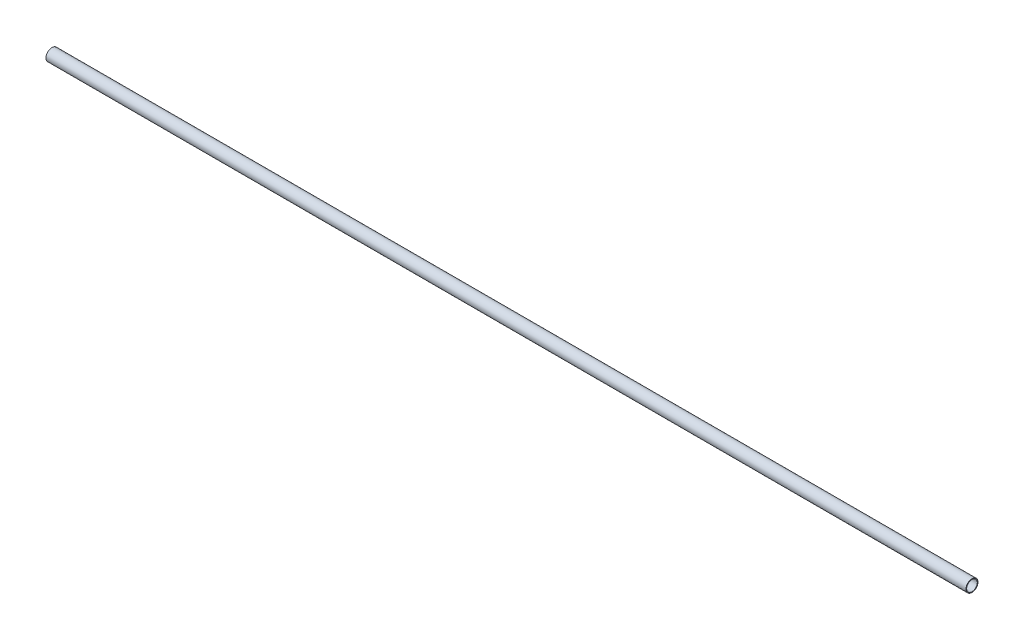
ISO-10303-21;
HEADER;
FILE_DESCRIPTION(('STEP AP214'),'2;1');
FILE_NAME('part.step','',(''),(''),'','','');
FILE_SCHEMA(('AUTOMOTIVE_DESIGN { 1 0 10303 214 1 1 1 1 }'));
ENDSEC;
DATA;
#1=APPLICATION_CONTEXT('core data for automotive mechanical design processes');
#2=APPLICATION_PROTOCOL_DEFINITION('international standard','automotive_design',2000,#1);
#3=PRODUCT_CONTEXT('',#1,'mechanical');
#4=PRODUCT('Part','Part','',(#3));
#5=PRODUCT_RELATED_PRODUCT_CATEGORY('part','',(#4));
#6=PRODUCT_DEFINITION_FORMATION('','',#4);
#7=PRODUCT_DEFINITION_CONTEXT('part definition',#1,'design');
#8=PRODUCT_DEFINITION('design','',#6,#7);
#9=PRODUCT_DEFINITION_SHAPE('','',#8);
#10=(LENGTH_UNIT() NAMED_UNIT(*) SI_UNIT(.MILLI.,.METRE.));
#11=(NAMED_UNIT(*) PLANE_ANGLE_UNIT() SI_UNIT($,.RADIAN.));
#12=(NAMED_UNIT(*) SI_UNIT($,.STERADIAN.) SOLID_ANGLE_UNIT());
#13=UNCERTAINTY_MEASURE_WITH_UNIT(LENGTH_MEASURE(1.E-05),#10,'distance_accuracy_value','');
#14=(GEOMETRIC_REPRESENTATION_CONTEXT(3) GLOBAL_UNCERTAINTY_ASSIGNED_CONTEXT((#13)) GLOBAL_UNIT_ASSIGNED_CONTEXT((#10,
#11,#12)) REPRESENTATION_CONTEXT('',''));
#15=CARTESIAN_POINT('',(0.,0.,0.));
#16=DIRECTION('',(0.,0.,1.));
#17=DIRECTION('',(1.,0.,0.));
#18=AXIS2_PLACEMENT_3D('',#15,#16,#17);
#19=CARTESIAN_POINT('',(1371.6,0.,0.));
#20=DIRECTION('',(-1.,0.,0.));
#21=DIRECTION('',(0.,0.,1.));
#22=AXIS2_PLACEMENT_3D('',#19,#20,#21);
#23=CYLINDRICAL_SURFACE('',#22,7.8994);
#24=CARTESIAN_POINT('',(1371.6,0.,0.));
#25=DIRECTION('',(1.,0.,0.));
#26=DIRECTION('',(0.,0.,-1.));
#27=AXIS2_PLACEMENT_3D('',#24,#25,#26);
#28=CIRCLE('',#27,7.8994);
#29=CARTESIAN_POINT('',(1371.6,0.,-7.8994));
#30=VERTEX_POINT('',#29);
#31=EDGE_CURVE('E37',#30,#30,#28,.T.);
#32=ORIENTED_EDGE('',*,*,#31,.T.);
#33=EDGE_LOOP('',(#32));
#34=FACE_BOUND('',#33,.T.);
#35=CARTESIAN_POINT('',(0.,0.,0.));
#36=DIRECTION('',(1.,0.,0.));
#37=DIRECTION('',(0.,0.,-1.));
#38=AXIS2_PLACEMENT_3D('',#35,#36,#37);
#39=CIRCLE('',#38,7.8994);
#40=CARTESIAN_POINT('',(0.,0.,-7.8994));
#41=VERTEX_POINT('',#40);
#42=EDGE_CURVE('E43',#41,#41,#39,.T.);
#43=ORIENTED_EDGE('',*,*,#42,.F.);
#44=EDGE_LOOP('',(#43));
#45=FACE_BOUND('',#44,.T.);
#46=ADVANCED_FACE('F30',(#34,#45),#23,.F.);
#47=CARTESIAN_POINT('',(1371.6,0.,0.));
#48=DIRECTION('',(-1.,0.,0.));
#49=DIRECTION('',(0.,0.,1.));
#50=AXIS2_PLACEMENT_3D('',#47,#48,#49);
#51=CYLINDRICAL_SURFACE('',#50,8.9662);
#52=CARTESIAN_POINT('',(1371.6,0.,0.));
#53=DIRECTION('',(1.,0.,0.));
#54=DIRECTION('',(0.,0.,-1.));
#55=AXIS2_PLACEMENT_3D('',#52,#53,#54);
#56=CIRCLE('',#55,8.9662);
#57=CARTESIAN_POINT('',(1371.6,0.,-8.9662));
#58=VERTEX_POINT('',#57);
#59=EDGE_CURVE('E10',#58,#58,#56,.T.);
#60=ORIENTED_EDGE('',*,*,#59,.F.);
#61=EDGE_LOOP('',(#60));
#62=FACE_BOUND('',#61,.T.);
#63=CARTESIAN_POINT('',(0.,0.,0.));
#64=DIRECTION('',(1.,0.,0.));
#65=DIRECTION('',(0.,0.,-1.));
#66=AXIS2_PLACEMENT_3D('',#63,#64,#65);
#67=CIRCLE('',#66,8.9662);
#68=CARTESIAN_POINT('',(0.,0.,-8.9662));
#69=VERTEX_POINT('',#68);
#70=EDGE_CURVE('E33',#69,#69,#67,.T.);
#71=ORIENTED_EDGE('',*,*,#70,.T.);
#72=EDGE_LOOP('',(#71));
#73=FACE_BOUND('',#72,.T.);
#74=ADVANCED_FACE('F50',(#62,#73),#51,.T.);
#75=CARTESIAN_POINT('',(1371.6,0.,0.));
#76=DIRECTION('',(1.,0.,0.));
#77=DIRECTION('',(0.,0.,-1.));
#78=AXIS2_PLACEMENT_3D('',#75,#76,#77);
#79=PLANE('',#78);
#80=ORIENTED_EDGE('',*,*,#31,.F.);
#81=EDGE_LOOP('',(#80));
#82=FACE_BOUND('',#81,.T.);
#83=ORIENTED_EDGE('',*,*,#59,.T.);
#84=EDGE_LOOP('',(#83));
#85=FACE_BOUND('',#84,.T.);
#86=ADVANCED_FACE('F54',(#82,#85),#79,.T.);
#87=CARTESIAN_POINT('',(0.,0.,0.));
#88=DIRECTION('',(1.,0.,0.));
#89=DIRECTION('',(0.,0.,-1.));
#90=AXIS2_PLACEMENT_3D('',#87,#88,#89);
#91=PLANE('',#90);
#92=ORIENTED_EDGE('',*,*,#42,.T.);
#93=EDGE_LOOP('',(#92));
#94=FACE_BOUND('',#93,.T.);
#95=ORIENTED_EDGE('',*,*,#70,.F.);
#96=EDGE_LOOP('',(#95));
#97=FACE_BOUND('',#96,.T.);
#98=ADVANCED_FACE('F52',(#94,#97),#91,.F.);
#99=CLOSED_SHELL('',(#46,#74,#86,#98));
#100=MANIFOLD_SOLID_BREP('B2',#99);
#101=ADVANCED_BREP_SHAPE_REPRESENTATION('',(#18,#100),#14);
#102=SHAPE_DEFINITION_REPRESENTATION(#9,#101);
ENDSEC;
END-ISO-10303-21;
